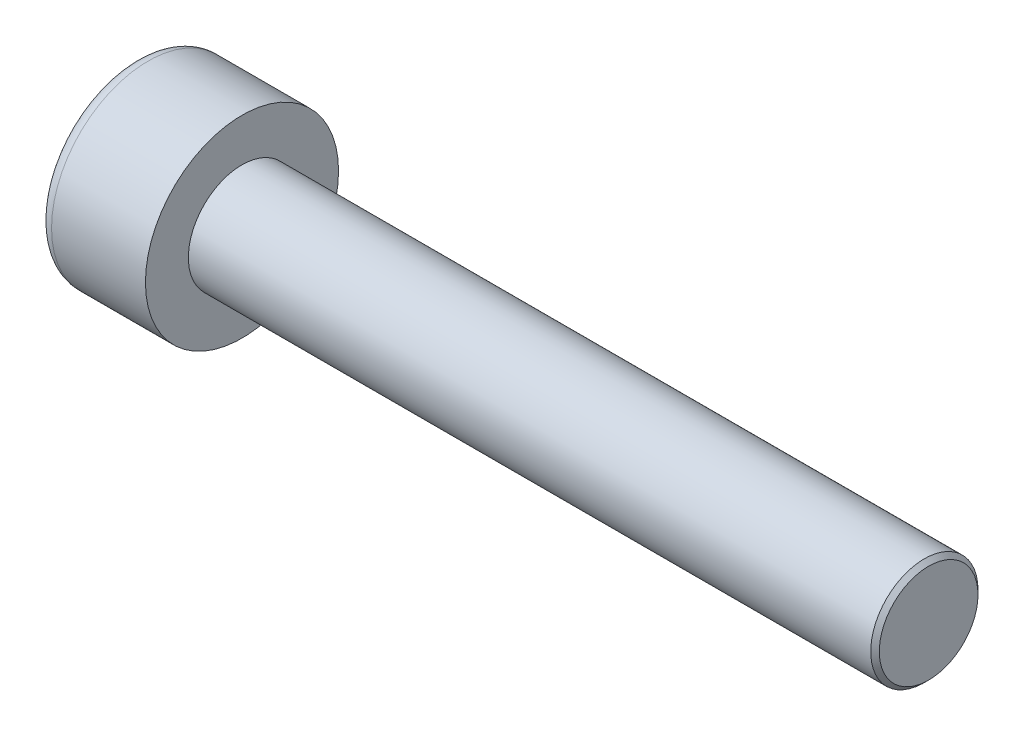
ISO-10303-21;
HEADER;
FILE_DESCRIPTION(('STEP AP214'),'2;1');
FILE_NAME('part.step','',(''),(''),'','','');
FILE_SCHEMA(('AUTOMOTIVE_DESIGN { 1 0 10303 214 1 1 1 1 }'));
ENDSEC;
DATA;
#1=APPLICATION_CONTEXT('core data for automotive mechanical design processes');
#2=APPLICATION_PROTOCOL_DEFINITION('international standard','automotive_design',2000,#1);
#3=PRODUCT_CONTEXT('',#1,'mechanical');
#4=PRODUCT('Part','Part','',(#3));
#5=PRODUCT_RELATED_PRODUCT_CATEGORY('part','',(#4));
#6=PRODUCT_DEFINITION_FORMATION('','',#4);
#7=PRODUCT_DEFINITION_CONTEXT('part definition',#1,'design');
#8=PRODUCT_DEFINITION('design','',#6,#7);
#9=PRODUCT_DEFINITION_SHAPE('','',#8);
#10=(LENGTH_UNIT() NAMED_UNIT(*) SI_UNIT(.MILLI.,.METRE.));
#11=(NAMED_UNIT(*) PLANE_ANGLE_UNIT() SI_UNIT($,.RADIAN.));
#12=(NAMED_UNIT(*) SI_UNIT($,.STERADIAN.) SOLID_ANGLE_UNIT());
#13=UNCERTAINTY_MEASURE_WITH_UNIT(LENGTH_MEASURE(1.E-05),#10,'distance_accuracy_value','');
#14=(GEOMETRIC_REPRESENTATION_CONTEXT(3) GLOBAL_UNCERTAINTY_ASSIGNED_CONTEXT((#13)) GLOBAL_UNIT_ASSIGNED_CONTEXT((#10,
#11,#12)) REPRESENTATION_CONTEXT('',''));
#15=CARTESIAN_POINT('',(0.,0.,0.));
#16=DIRECTION('',(0.,0.,1.));
#17=DIRECTION('',(1.,0.,0.));
#18=AXIS2_PLACEMENT_3D('',#15,#16,#17);
#19=CARTESIAN_POINT('',(1.1,-2.,0.));
#20=DIRECTION('',(-1.,0.,0.));
#21=DIRECTION('',(0.,0.,1.));
#22=AXIS2_PLACEMENT_3D('',#19,#20,#21);
#23=PLANE('',#22);
#24=DIRECTION('',(0.,-0.866025403784436,-0.500000000000004));
#25=VECTOR('',#24,1.);
#26=CARTESIAN_POINT('',(1.1,0.,1.15470053837925));
#27=LINE('',#26,#25);
#28=CARTESIAN_POINT('',(1.1,-0.500000000000005,0.866025403784437));
#29=VERTEX_POINT('',#28);
#30=CARTESIAN_POINT('',(1.1,-1.,0.577350269189621));
#31=VERTEX_POINT('',#30);
#32=EDGE_CURVE('E150',#29,#31,#27,.T.);
#33=ORIENTED_EDGE('',*,*,#32,.F.);
#34=CARTESIAN_POINT('',(1.1,0.,0.));
#35=DIRECTION('',(-1.,0.,0.));
#36=DIRECTION('',(0.,0.,1.));
#37=AXIS2_PLACEMENT_3D('',#34,#35,#36);
#38=CIRCLE('',#37,1.00000000000001);
#39=CARTESIAN_POINT('',(1.1,-1.00000000000001,0.));
#40=VERTEX_POINT('',#39);
#41=EDGE_CURVE('E45',#29,#40,#38,.F.);
#42=ORIENTED_EDGE('',*,*,#41,.T.);
#43=DIRECTION('',(0.,0.,-1.));
#44=VECTOR('',#43,1.);
#45=CARTESIAN_POINT('',(1.1,-1.,0.577350269189621));
#46=LINE('',#45,#44);
#47=EDGE_CURVE('E155',#31,#40,#46,.T.);
#48=ORIENTED_EDGE('',*,*,#47,.F.);
#49=EDGE_LOOP('',(#33,#42,#48));
#50=FACE_BOUND('',#49,.T.);
#51=ADVANCED_FACE('F30',(#50),#23,.T.);
#52=CARTESIAN_POINT('',(1.1,-1.,-0.577350269189633));
#53=VERTEX_POINT('',#52);
#54=EDGE_CURVE('E154',#40,#53,#46,.T.);
#55=ORIENTED_EDGE('',*,*,#54,.F.);
#56=CARTESIAN_POINT('',(1.1,-0.5,-0.866025403784444));
#57=VERTEX_POINT('',#56);
#58=EDGE_CURVE('E130',#40,#57,#38,.F.);
#59=ORIENTED_EDGE('',*,*,#58,.T.);
#60=DIRECTION('',(0.,0.86602540378444,-0.499999999999998));
#61=VECTOR('',#60,1.);
#62=CARTESIAN_POINT('',(1.1,-1.,-0.577350269189633));
#63=LINE('',#62,#61);
#64=EDGE_CURVE('E138',#53,#57,#63,.T.);
#65=ORIENTED_EDGE('',*,*,#64,.F.);
#66=EDGE_LOOP('',(#55,#59,#65));
#67=FACE_BOUND('',#66,.T.);
#68=ADVANCED_FACE('F210',(#67),#23,.T.);
#69=CARTESIAN_POINT('',(1.1,0.,-1.15470053837925));
#70=VERTEX_POINT('',#69);
#71=EDGE_CURVE('E128',#57,#70,#63,.T.);
#72=ORIENTED_EDGE('',*,*,#71,.F.);
#73=CARTESIAN_POINT('',(1.1,0.500000000000006,-0.866025403784441));
#74=VERTEX_POINT('',#73);
#75=EDGE_CURVE('E112',#57,#74,#38,.F.);
#76=ORIENTED_EDGE('',*,*,#75,.T.);
#77=DIRECTION('',(0.,0.866025403784437,0.500000000000003));
#78=VECTOR('',#77,1.);
#79=CARTESIAN_POINT('',(1.1,0.,-1.15470053837925));
#80=LINE('',#79,#78);
#81=EDGE_CURVE('E126',#70,#74,#80,.T.);
#82=ORIENTED_EDGE('',*,*,#81,.F.);
#83=EDGE_LOOP('',(#72,#76,#82));
#84=FACE_BOUND('',#83,.T.);
#85=ADVANCED_FACE('F124',(#84),#23,.T.);
#86=CARTESIAN_POINT('',(1.1,1.,-0.577350269189618));
#87=VERTEX_POINT('',#86);
#88=EDGE_CURVE('E132',#74,#87,#80,.T.);
#89=ORIENTED_EDGE('',*,*,#88,.F.);
#90=CARTESIAN_POINT('',(1.1,0.,0.));
#91=DIRECTION('',(1.,0.,0.));
#92=DIRECTION('',(0.,0.,-1.));
#93=AXIS2_PLACEMENT_3D('',#90,#91,#92);
#94=CIRCLE('',#93,1.00000000000001);
#95=CARTESIAN_POINT('',(1.1,1.00000000000001,0.));
#96=VERTEX_POINT('',#95);
#97=EDGE_CURVE('E110',#74,#96,#94,.T.);
#98=ORIENTED_EDGE('',*,*,#97,.T.);
#99=DIRECTION('',(0.,0.,1.));
#100=VECTOR('',#99,1.);
#101=CARTESIAN_POINT('',(1.1,1.,-0.577350269189618));
#102=LINE('',#101,#100);
#103=EDGE_CURVE('E135',#87,#96,#102,.T.);
#104=ORIENTED_EDGE('',*,*,#103,.F.);
#105=EDGE_LOOP('',(#89,#98,#104));
#106=FACE_BOUND('',#105,.T.);
#107=ADVANCED_FACE('F133',(#106),#23,.T.);
#108=CARTESIAN_POINT('',(1.1,0.999999999999997,0.577350269189631));
#109=VERTEX_POINT('',#108);
#110=EDGE_CURVE('E142',#96,#109,#102,.T.);
#111=ORIENTED_EDGE('',*,*,#110,.F.);
#112=CARTESIAN_POINT('',(1.1,0.499999999999998,0.866025403784445));
#113=VERTEX_POINT('',#112);
#114=EDGE_CURVE('E115',#96,#113,#38,.F.);
#115=ORIENTED_EDGE('',*,*,#114,.T.);
#116=DIRECTION('',(0.,-0.866025403784441,0.499999999999996));
#117=VECTOR('',#116,1.);
#118=CARTESIAN_POINT('',(1.1,0.999999999999997,0.577350269189631));
#119=LINE('',#118,#117);
#120=EDGE_CURVE('E147',#109,#113,#119,.T.);
#121=ORIENTED_EDGE('',*,*,#120,.F.);
#122=EDGE_LOOP('',(#111,#115,#121));
#123=FACE_BOUND('',#122,.T.);
#124=ADVANCED_FACE('F222',(#123),#23,.T.);
#125=CARTESIAN_POINT('',(1.1,0.,1.15470053837925));
#126=VERTEX_POINT('',#125);
#127=EDGE_CURVE('E146',#113,#126,#119,.T.);
#128=ORIENTED_EDGE('',*,*,#127,.F.);
#129=EDGE_CURVE('E190',#113,#29,#38,.F.);
#130=ORIENTED_EDGE('',*,*,#129,.T.);
#131=EDGE_CURVE('E151',#126,#29,#27,.T.);
#132=ORIENTED_EDGE('',*,*,#131,.F.);
#133=EDGE_LOOP('',(#128,#130,#132));
#134=FACE_BOUND('',#133,.T.);
#135=ADVANCED_FACE('F213',(#134),#23,.T.);
#136=CARTESIAN_POINT('',(0.,0.,0.));
#137=DIRECTION('',(1.,0.,0.));
#138=DIRECTION('',(0.,0.,-1.));
#139=AXIS2_PLACEMENT_3D('',#136,#137,#138);
#140=PLANE('',#139);
#141=CARTESIAN_POINT('',(0.,0.,0.));
#142=DIRECTION('',(1.,0.,0.));
#143=DIRECTION('',(0.,0.,-1.));
#144=AXIS2_PLACEMENT_3D('',#141,#142,#143);
#145=CIRCLE('',#144,1.9375);
#146=CARTESIAN_POINT('',(0.,0.,-1.9375));
#147=VERTEX_POINT('',#146);
#148=EDGE_CURVE('E195',#147,#147,#145,.F.);
#149=ORIENTED_EDGE('',*,*,#148,.T.);
#150=EDGE_LOOP('',(#149));
#151=FACE_BOUND('',#150,.T.);
#152=DIRECTION('',(0.,0.86602540378444,-0.499999999999998));
#153=VECTOR('',#152,1.);
#154=CARTESIAN_POINT('',(0.,-1.,-0.577350269189633));
#155=LINE('',#154,#153);
#156=CARTESIAN_POINT('',(0.,-1.,-0.577350269189633));
#157=VERTEX_POINT('',#156);
#158=CARTESIAN_POINT('',(0.,0.,-1.15470053837925));
#159=VERTEX_POINT('',#158);
#160=EDGE_CURVE('E53',#157,#159,#155,.T.);
#161=ORIENTED_EDGE('',*,*,#160,.T.);
#162=DIRECTION('',(0.,0.866025403784437,0.500000000000003));
#163=VECTOR('',#162,1.);
#164=CARTESIAN_POINT('',(0.,0.,-1.15470053837925));
#165=LINE('',#164,#163);
#166=CARTESIAN_POINT('',(0.,1.,-0.577350269189618));
#167=VERTEX_POINT('',#166);
#168=EDGE_CURVE('E160',#159,#167,#165,.T.);
#169=ORIENTED_EDGE('',*,*,#168,.T.);
#170=DIRECTION('',(0.,0.,1.));
#171=VECTOR('',#170,1.);
#172=CARTESIAN_POINT('',(0.,1.,-0.577350269189618));
#173=LINE('',#172,#171);
#174=CARTESIAN_POINT('',(0.,0.999999999999997,0.577350269189631));
#175=VERTEX_POINT('',#174);
#176=EDGE_CURVE('E163',#167,#175,#173,.T.);
#177=ORIENTED_EDGE('',*,*,#176,.T.);
#178=DIRECTION('',(0.,-0.866025403784441,0.499999999999996));
#179=VECTOR('',#178,1.);
#180=CARTESIAN_POINT('',(0.,0.999999999999997,0.577350269189631));
#181=LINE('',#180,#179);
#182=CARTESIAN_POINT('',(0.,0.,1.15470053837925));
#183=VERTEX_POINT('',#182);
#184=EDGE_CURVE('E166',#175,#183,#181,.T.);
#185=ORIENTED_EDGE('',*,*,#184,.T.);
#186=DIRECTION('',(0.,-0.866025403784436,-0.500000000000004));
#187=VECTOR('',#186,1.);
#188=CARTESIAN_POINT('',(0.,0.,1.15470053837925));
#189=LINE('',#188,#187);
#190=CARTESIAN_POINT('',(0.,-1.,0.577350269189621));
#191=VERTEX_POINT('',#190);
#192=EDGE_CURVE('E169',#183,#191,#189,.T.);
#193=ORIENTED_EDGE('',*,*,#192,.T.);
#194=DIRECTION('',(0.,0.,-1.));
#195=VECTOR('',#194,1.);
#196=CARTESIAN_POINT('',(0.,-1.,0.577350269189621));
#197=LINE('',#196,#195);
#198=EDGE_CURVE('E172',#191,#157,#197,.T.);
#199=ORIENTED_EDGE('',*,*,#198,.T.);
#200=EDGE_LOOP('',(#161,#169,#177,#185,#193,#199));
#201=FACE_BOUND('',#200,.T.);
#202=ADVANCED_FACE('F221',(#151,#201),#140,.F.);
#203=CARTESIAN_POINT('',(2.5,0.,0.));
#204=DIRECTION('',(1.,0.,0.));
#205=DIRECTION('',(0.,0.,-1.));
#206=AXIS2_PLACEMENT_3D('',#203,#204,#205);
#207=PLANE('',#206);
#208=CARTESIAN_POINT('',(2.5,0.,0.));
#209=DIRECTION('',(1.,0.,0.));
#210=DIRECTION('',(0.,0.,-1.));
#211=AXIS2_PLACEMENT_3D('',#208,#209,#210);
#212=CIRCLE('',#211,2.25);
#213=CARTESIAN_POINT('',(2.5,0.,-2.25));
#214=VERTEX_POINT('',#213);
#215=EDGE_CURVE('E188',#214,#214,#212,.T.);
#216=ORIENTED_EDGE('',*,*,#215,.T.);
#217=EDGE_LOOP('',(#216));
#218=FACE_BOUND('',#217,.T.);
#219=CARTESIAN_POINT('',(2.5,0.,0.));
#220=DIRECTION('',(1.,0.,0.));
#221=DIRECTION('',(0.,0.,-1.));
#222=AXIS2_PLACEMENT_3D('',#219,#220,#221);
#223=CIRCLE('',#222,1.25);
#224=CARTESIAN_POINT('',(2.5,0.,-1.25));
#225=VERTEX_POINT('',#224);
#226=EDGE_CURVE('E185',#225,#225,#223,.T.);
#227=ORIENTED_EDGE('',*,*,#226,.F.);
#228=EDGE_LOOP('',(#227));
#229=FACE_BOUND('',#228,.T.);
#230=ADVANCED_FACE('F228',(#218,#229),#207,.T.);
#231=CARTESIAN_POINT('',(2.5,0.,0.));
#232=DIRECTION('',(-1.,0.,0.));
#233=DIRECTION('',(0.,0.,1.));
#234=AXIS2_PLACEMENT_3D('',#231,#232,#233);
#235=CYLINDRICAL_SURFACE('',#234,2.25);
#236=CARTESIAN_POINT('',(0.3125,0.,0.));
#237=DIRECTION('',(1.,0.,0.));
#238=DIRECTION('',(0.,0.,-1.));
#239=AXIS2_PLACEMENT_3D('',#236,#237,#238);
#240=CIRCLE('',#239,2.25);
#241=CARTESIAN_POINT('',(0.3125,0.,-2.25));
#242=VERTEX_POINT('',#241);
#243=EDGE_CURVE('E192',#242,#242,#240,.T.);
#244=ORIENTED_EDGE('',*,*,#243,.T.);
#245=EDGE_LOOP('',(#244));
#246=FACE_BOUND('',#245,.T.);
#247=ORIENTED_EDGE('',*,*,#215,.F.);
#248=EDGE_LOOP('',(#247));
#249=FACE_BOUND('',#248,.T.);
#250=ADVANCED_FACE('F273',(#246,#249),#235,.T.);
#251=CARTESIAN_POINT('',(18.5,0.,0.));
#252=DIRECTION('',(-1.,0.,0.));
#253=DIRECTION('',(0.,0.,1.));
#254=AXIS2_PLACEMENT_3D('',#251,#252,#253);
#255=CYLINDRICAL_SURFACE('',#254,1.25);
#256=CARTESIAN_POINT('',(18.4,0.,0.));
#257=DIRECTION('',(1.,0.,0.));
#258=DIRECTION('',(0.,0.,-1.));
#259=AXIS2_PLACEMENT_3D('',#256,#257,#258);
#260=CIRCLE('',#259,1.25);
#261=CARTESIAN_POINT('',(18.4,0.,-1.25));
#262=VERTEX_POINT('',#261);
#263=EDGE_CURVE('E11',#262,#262,#260,.F.);
#264=ORIENTED_EDGE('',*,*,#263,.T.);
#265=EDGE_LOOP('',(#264));
#266=FACE_BOUND('',#265,.T.);
#267=ORIENTED_EDGE('',*,*,#226,.T.);
#268=EDGE_LOOP('',(#267));
#269=FACE_BOUND('',#268,.T.);
#270=ADVANCED_FACE('F270',(#266,#269),#255,.T.);
#271=CARTESIAN_POINT('',(18.5,0.,0.));
#272=DIRECTION('',(1.,0.,0.));
#273=DIRECTION('',(0.,0.,-1.));
#274=AXIS2_PLACEMENT_3D('',#271,#272,#273);
#275=PLANE('',#274);
#276=CARTESIAN_POINT('',(18.5,0.,0.));
#277=DIRECTION('',(1.,0.,0.));
#278=DIRECTION('',(0.,0.,-1.));
#279=AXIS2_PLACEMENT_3D('',#276,#277,#278);
#280=CIRCLE('',#279,1.15);
#281=CARTESIAN_POINT('',(18.5,0.,-1.15));
#282=VERTEX_POINT('',#281);
#283=EDGE_CURVE('E38',#282,#282,#280,.T.);
#284=ORIENTED_EDGE('',*,*,#283,.T.);
#285=EDGE_LOOP('',(#284));
#286=FACE_BOUND('',#285,.T.);
#287=ADVANCED_FACE('F200',(#286),#275,.T.);
#288=CARTESIAN_POINT('',(1.1,-1.,-0.577350269189633));
#289=DIRECTION('',(0.,0.499999999999998,0.86602540378444));
#290=DIRECTION('',(0.,-0.86602540378444,0.499999999999998));
#291=AXIS2_PLACEMENT_3D('',#288,#289,#290);
#292=PLANE('',#291);
#293=ORIENTED_EDGE('',*,*,#160,.F.);
#294=DIRECTION('',(-1.,0.,0.));
#295=VECTOR('',#294,1.);
#296=CARTESIAN_POINT('',(1.1,-1.,-0.577350269189633));
#297=LINE('',#296,#295);
#298=EDGE_CURVE('E158',#53,#157,#297,.T.);
#299=ORIENTED_EDGE('',*,*,#298,.F.);
#300=ORIENTED_EDGE('',*,*,#64,.T.);
#301=ORIENTED_EDGE('',*,*,#71,.T.);
#302=DIRECTION('',(-1.,0.,0.));
#303=VECTOR('',#302,1.);
#304=CARTESIAN_POINT('',(1.1,0.,-1.15470053837925));
#305=LINE('',#304,#303);
#306=EDGE_CURVE('E141',#70,#159,#305,.T.);
#307=ORIENTED_EDGE('',*,*,#306,.T.);
#308=EDGE_LOOP('',(#293,#299,#300,#301,#307));
#309=FACE_BOUND('',#308,.T.);
#310=ADVANCED_FACE('F244',(#309),#292,.T.);
#311=CARTESIAN_POINT('',(1.1,0.,-1.15470053837925));
#312=DIRECTION('',(0.,-0.500000000000003,0.866025403784437));
#313=DIRECTION('',(0.,-0.866025403784437,-0.500000000000003));
#314=AXIS2_PLACEMENT_3D('',#311,#312,#313);
#315=PLANE('',#314);
#316=ORIENTED_EDGE('',*,*,#168,.F.);
#317=ORIENTED_EDGE('',*,*,#306,.F.);
#318=ORIENTED_EDGE('',*,*,#81,.T.);
#319=ORIENTED_EDGE('',*,*,#88,.T.);
#320=DIRECTION('',(-1.,0.,0.));
#321=VECTOR('',#320,1.);
#322=CARTESIAN_POINT('',(1.1,1.,-0.577350269189618));
#323=LINE('',#322,#321);
#324=EDGE_CURVE('E182',#87,#167,#323,.T.);
#325=ORIENTED_EDGE('',*,*,#324,.T.);
#326=EDGE_LOOP('',(#316,#317,#318,#319,#325));
#327=FACE_BOUND('',#326,.T.);
#328=ADVANCED_FACE('F140',(#327),#315,.T.);
#329=CARTESIAN_POINT('',(1.1,1.,-0.577350269189618));
#330=DIRECTION('',(0.,-1.,0.));
#331=DIRECTION('',(0.,0.,-1.));
#332=AXIS2_PLACEMENT_3D('',#329,#330,#331);
#333=PLANE('',#332);
#334=ORIENTED_EDGE('',*,*,#176,.F.);
#335=ORIENTED_EDGE('',*,*,#324,.F.);
#336=ORIENTED_EDGE('',*,*,#103,.T.);
#337=ORIENTED_EDGE('',*,*,#110,.T.);
#338=DIRECTION('',(-1.,0.,0.));
#339=VECTOR('',#338,1.);
#340=CARTESIAN_POINT('',(1.1,0.999999999999997,0.577350269189631));
#341=LINE('',#340,#339);
#342=EDGE_CURVE('E180',#109,#175,#341,.T.);
#343=ORIENTED_EDGE('',*,*,#342,.T.);
#344=EDGE_LOOP('',(#334,#335,#336,#337,#343));
#345=FACE_BOUND('',#344,.T.);
#346=ADVANCED_FACE('F242',(#345),#333,.T.);
#347=CARTESIAN_POINT('',(1.1,0.999999999999997,0.577350269189631));
#348=DIRECTION('',(0.,-0.499999999999996,-0.866025403784441));
#349=DIRECTION('',(0.,0.866025403784441,-0.499999999999996));
#350=AXIS2_PLACEMENT_3D('',#347,#348,#349);
#351=PLANE('',#350);
#352=ORIENTED_EDGE('',*,*,#184,.F.);
#353=ORIENTED_EDGE('',*,*,#342,.F.);
#354=ORIENTED_EDGE('',*,*,#120,.T.);
#355=ORIENTED_EDGE('',*,*,#127,.T.);
#356=DIRECTION('',(-1.,0.,0.));
#357=VECTOR('',#356,1.);
#358=CARTESIAN_POINT('',(1.1,0.,1.15470053837925));
#359=LINE('',#358,#357);
#360=EDGE_CURVE('E178',#126,#183,#359,.T.);
#361=ORIENTED_EDGE('',*,*,#360,.T.);
#362=EDGE_LOOP('',(#352,#353,#354,#355,#361));
#363=FACE_BOUND('',#362,.T.);
#364=ADVANCED_FACE('F239',(#363),#351,.T.);
#365=CARTESIAN_POINT('',(1.1,0.,1.15470053837925));
#366=DIRECTION('',(0.,0.500000000000004,-0.866025403784436));
#367=DIRECTION('',(0.,0.866025403784436,0.500000000000004));
#368=AXIS2_PLACEMENT_3D('',#365,#366,#367);
#369=PLANE('',#368);
#370=ORIENTED_EDGE('',*,*,#192,.F.);
#371=ORIENTED_EDGE('',*,*,#360,.F.);
#372=ORIENTED_EDGE('',*,*,#131,.T.);
#373=ORIENTED_EDGE('',*,*,#32,.T.);
#374=DIRECTION('',(-1.,0.,0.));
#375=VECTOR('',#374,1.);
#376=CARTESIAN_POINT('',(1.1,-1.,0.577350269189621));
#377=LINE('',#376,#375);
#378=EDGE_CURVE('E176',#31,#191,#377,.T.);
#379=ORIENTED_EDGE('',*,*,#378,.T.);
#380=EDGE_LOOP('',(#370,#371,#372,#373,#379));
#381=FACE_BOUND('',#380,.T.);
#382=ADVANCED_FACE('F253',(#381),#369,.T.);
#383=CARTESIAN_POINT('',(1.1,-1.,0.577350269189621));
#384=DIRECTION('',(0.,1.,0.));
#385=DIRECTION('',(0.,0.,1.));
#386=AXIS2_PLACEMENT_3D('',#383,#384,#385);
#387=PLANE('',#386);
#388=ORIENTED_EDGE('',*,*,#198,.F.);
#389=ORIENTED_EDGE('',*,*,#378,.F.);
#390=ORIENTED_EDGE('',*,*,#47,.T.);
#391=ORIENTED_EDGE('',*,*,#54,.T.);
#392=ORIENTED_EDGE('',*,*,#298,.T.);
#393=EDGE_LOOP('',(#388,#389,#390,#391,#392));
#394=FACE_BOUND('',#393,.T.);
#395=ADVANCED_FACE('F107',(#394),#387,.T.);
#396=CARTESIAN_POINT('',(1.1,0.,0.));
#397=DIRECTION('',(-1.,0.,0.));
#398=DIRECTION('',(0.,0.,1.));
#399=AXIS2_PLACEMENT_3D('',#396,#397,#398);
#400=CONICAL_SURFACE('',#399,1.00000000000001,1.04719755119659);
#401=CARTESIAN_POINT('',(1.67735026918964,0.,0.));
#402=VERTEX_POINT('',#401);
#403=VERTEX_LOOP('',#402);
#404=FACE_BOUND('',#403,.T.);
#405=ORIENTED_EDGE('',*,*,#97,.F.);
#406=ORIENTED_EDGE('',*,*,#75,.F.);
#407=ORIENTED_EDGE('',*,*,#58,.F.);
#408=ORIENTED_EDGE('',*,*,#41,.F.);
#409=ORIENTED_EDGE('',*,*,#129,.F.);
#410=ORIENTED_EDGE('',*,*,#114,.F.);
#411=EDGE_LOOP('',(#405,#406,#407,#408,#409,#410));
#412=FACE_BOUND('',#411,.T.);
#413=ADVANCED_FACE('F104',(#404,#412),#400,.F.);
#414=CARTESIAN_POINT('',(0.3125,0.,0.));
#415=DIRECTION('',(1.,0.,0.));
#416=DIRECTION('',(0.,0.,-1.));
#417=AXIS2_PLACEMENT_3D('',#414,#415,#416);
#418=TOROIDAL_SURFACE('',#417,1.9375,0.3125);
#419=ORIENTED_EDGE('',*,*,#148,.F.);
#420=EDGE_LOOP('',(#419));
#421=FACE_BOUND('',#420,.T.);
#422=ORIENTED_EDGE('',*,*,#243,.F.);
#423=EDGE_LOOP('',(#422));
#424=FACE_BOUND('',#423,.T.);
#425=ADVANCED_FACE('F106',(#421,#424),#418,.T.);
#426=CARTESIAN_POINT('',(18.5,0.,0.));
#427=DIRECTION('',(-1.,0.,0.));
#428=DIRECTION('',(0.,0.,1.));
#429=AXIS2_PLACEMENT_3D('',#426,#427,#428);
#430=CONICAL_SURFACE('',#429,1.15,0.785398163397431);
#431=ORIENTED_EDGE('',*,*,#263,.F.);
#432=EDGE_LOOP('',(#431));
#433=FACE_BOUND('',#432,.T.);
#434=ORIENTED_EDGE('',*,*,#283,.F.);
#435=EDGE_LOOP('',(#434));
#436=FACE_BOUND('',#435,.T.);
#437=ADVANCED_FACE('F32',(#433,#436),#430,.T.);
#438=CLOSED_SHELL('',(#51,#68,#85,#107,#124,#135,#202,#230,#250,#270,#287,#310,#328,#346,#364,
#382,#395,#413,#425,#437));
#439=MANIFOLD_SOLID_BREP('B2',#438);
#440=ADVANCED_BREP_SHAPE_REPRESENTATION('',(#18,#439),#14);
#441=SHAPE_DEFINITION_REPRESENTATION(#9,#440);
ENDSEC;
END-ISO-10303-21;
